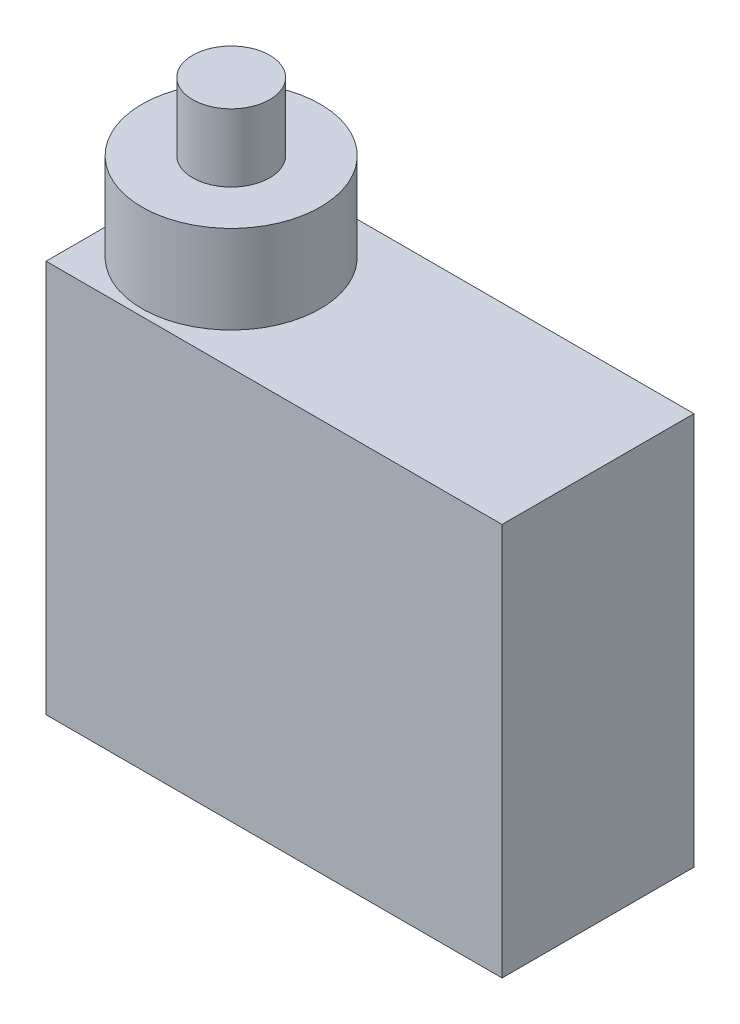
ISO-10303-21;
HEADER;
FILE_DESCRIPTION(('STEP AP214'),'2;1');
FILE_NAME('part.step','',(''),(''),'','','');
FILE_SCHEMA(('AUTOMOTIVE_DESIGN { 1 0 10303 214 1 1 1 1 }'));
ENDSEC;
DATA;
#1=APPLICATION_CONTEXT('core data for automotive mechanical design processes');
#2=APPLICATION_PROTOCOL_DEFINITION('international standard','automotive_design',2000,#1);
#3=PRODUCT_CONTEXT('',#1,'mechanical');
#4=PRODUCT('Part','Part','',(#3));
#5=PRODUCT_RELATED_PRODUCT_CATEGORY('part','',(#4));
#6=PRODUCT_DEFINITION_FORMATION('','',#4);
#7=PRODUCT_DEFINITION_CONTEXT('part definition',#1,'design');
#8=PRODUCT_DEFINITION('design','',#6,#7);
#9=PRODUCT_DEFINITION_SHAPE('','',#8);
#10=(LENGTH_UNIT() NAMED_UNIT(*) SI_UNIT(.MILLI.,.METRE.));
#11=(NAMED_UNIT(*) PLANE_ANGLE_UNIT() SI_UNIT($,.RADIAN.));
#12=(NAMED_UNIT(*) SI_UNIT($,.STERADIAN.) SOLID_ANGLE_UNIT());
#13=UNCERTAINTY_MEASURE_WITH_UNIT(LENGTH_MEASURE(1.E-05),#10,'distance_accuracy_value','');
#14=(GEOMETRIC_REPRESENTATION_CONTEXT(3) GLOBAL_UNCERTAINTY_ASSIGNED_CONTEXT((#13)) GLOBAL_UNIT_ASSIGNED_CONTEXT((#10,
#11,#12)) REPRESENTATION_CONTEXT('',''));
#15=CARTESIAN_POINT('',(0.,0.,0.));
#16=DIRECTION('',(0.,0.,1.));
#17=DIRECTION('',(1.,0.,0.));
#18=AXIS2_PLACEMENT_3D('',#15,#16,#17);
#19=CARTESIAN_POINT('',(-10.1,8.7,8.5));
#20=DIRECTION('',(1.,0.,0.));
#21=DIRECTION('',(0.,1.,0.));
#22=AXIS2_PLACEMENT_3D('',#19,#20,#21);
#23=PLANE('',#22);
#24=DIRECTION('',(0.,-1.,0.));
#25=VECTOR('',#24,1.);
#26=CARTESIAN_POINT('',(-10.1,8.7,0.));
#27=LINE('',#26,#25);
#28=CARTESIAN_POINT('',(-10.1,8.7,0.));
#29=VERTEX_POINT('',#28);
#30=CARTESIAN_POINT('',(-10.1,-8.7,0.));
#31=VERTEX_POINT('',#30);
#32=EDGE_CURVE('E109',#29,#31,#27,.T.);
#33=ORIENTED_EDGE('',*,*,#32,.T.);
#34=DIRECTION('',(0.,0.,-1.));
#35=VECTOR('',#34,1.);
#36=CARTESIAN_POINT('',(-10.1,-8.7,8.5));
#37=LINE('',#36,#35);
#38=CARTESIAN_POINT('',(-10.1,-8.7,8.5));
#39=VERTEX_POINT('',#38);
#40=EDGE_CURVE('E36',#39,#31,#37,.T.);
#41=ORIENTED_EDGE('',*,*,#40,.F.);
#42=DIRECTION('',(0.,-1.,0.));
#43=VECTOR('',#42,1.);
#44=CARTESIAN_POINT('',(-10.1,8.7,8.5));
#45=LINE('',#44,#43);
#46=CARTESIAN_POINT('',(-10.1,8.7,8.5));
#47=VERTEX_POINT('',#46);
#48=EDGE_CURVE('E89',#47,#39,#45,.T.);
#49=ORIENTED_EDGE('',*,*,#48,.F.);
#50=DIRECTION('',(0.,0.,-1.));
#51=VECTOR('',#50,1.);
#52=CARTESIAN_POINT('',(-10.1,8.7,8.5));
#53=LINE('',#52,#51);
#54=CARTESIAN_POINT('',(-10.1,8.7,4.25));
#55=VERTEX_POINT('',#54);
#56=EDGE_CURVE('E87',#47,#55,#53,.T.);
#57=ORIENTED_EDGE('',*,*,#56,.T.);
#58=EDGE_CURVE('E76',#55,#29,#53,.T.);
#59=ORIENTED_EDGE('',*,*,#58,.T.);
#60=EDGE_LOOP('',(#33,#41,#49,#57,#59));
#61=FACE_BOUND('',#60,.T.);
#62=ADVANCED_FACE('F33',(#61),#23,.F.);
#63=CARTESIAN_POINT('',(10.1,-8.7,8.5));
#64=DIRECTION('',(0.,1.,0.));
#65=DIRECTION('',(-1.,0.,0.));
#66=AXIS2_PLACEMENT_3D('',#63,#64,#65);
#67=PLANE('',#66);
#68=DIRECTION('',(1.,0.,0.));
#69=VECTOR('',#68,1.);
#70=CARTESIAN_POINT('',(10.1,-8.7,0.));
#71=LINE('',#70,#69);
#72=CARTESIAN_POINT('',(10.1,-8.7,0.));
#73=VERTEX_POINT('',#72);
#74=EDGE_CURVE('E108',#31,#73,#71,.T.);
#75=ORIENTED_EDGE('',*,*,#74,.T.);
#76=DIRECTION('',(0.,0.,-1.));
#77=VECTOR('',#76,1.);
#78=CARTESIAN_POINT('',(10.1,-8.7,8.5));
#79=LINE('',#78,#77);
#80=CARTESIAN_POINT('',(10.1,-8.7,8.5));
#81=VERTEX_POINT('',#80);
#82=EDGE_CURVE('E105',#81,#73,#79,.T.);
#83=ORIENTED_EDGE('',*,*,#82,.F.);
#84=DIRECTION('',(1.,0.,0.));
#85=VECTOR('',#84,1.);
#86=CARTESIAN_POINT('',(10.1,-8.7,8.5));
#87=LINE('',#86,#85);
#88=EDGE_CURVE('E84',#39,#81,#87,.T.);
#89=ORIENTED_EDGE('',*,*,#88,.F.);
#90=ORIENTED_EDGE('',*,*,#40,.T.);
#91=EDGE_LOOP('',(#75,#83,#89,#90));
#92=FACE_BOUND('',#91,.T.);
#93=ADVANCED_FACE('F107',(#92),#67,.F.);
#94=CARTESIAN_POINT('',(10.1,8.7,8.5));
#95=DIRECTION('',(-1.,0.,0.));
#96=DIRECTION('',(0.,-1.,0.));
#97=AXIS2_PLACEMENT_3D('',#94,#95,#96);
#98=PLANE('',#97);
#99=DIRECTION('',(0.,1.,0.));
#100=VECTOR('',#99,1.);
#101=CARTESIAN_POINT('',(10.1,8.7,0.));
#102=LINE('',#101,#100);
#103=CARTESIAN_POINT('',(10.1,8.7,0.));
#104=VERTEX_POINT('',#103);
#105=EDGE_CURVE('E68',#73,#104,#102,.T.);
#106=ORIENTED_EDGE('',*,*,#105,.T.);
#107=DIRECTION('',(0.,0.,-1.));
#108=VECTOR('',#107,1.);
#109=CARTESIAN_POINT('',(10.1,8.7,8.5));
#110=LINE('',#109,#108);
#111=CARTESIAN_POINT('',(10.1,8.7,8.5));
#112=VERTEX_POINT('',#111);
#113=EDGE_CURVE('E92',#112,#104,#110,.T.);
#114=ORIENTED_EDGE('',*,*,#113,.F.);
#115=DIRECTION('',(0.,1.,0.));
#116=VECTOR('',#115,1.);
#117=CARTESIAN_POINT('',(10.1,8.7,8.5));
#118=LINE('',#117,#116);
#119=EDGE_CURVE('E100',#81,#112,#118,.T.);
#120=ORIENTED_EDGE('',*,*,#119,.F.);
#121=ORIENTED_EDGE('',*,*,#82,.T.);
#122=EDGE_LOOP('',(#106,#114,#120,#121));
#123=FACE_BOUND('',#122,.T.);
#124=ADVANCED_FACE('F121',(#123),#98,.F.);
#125=CARTESIAN_POINT('',(10.1,8.7,8.5));
#126=DIRECTION('',(0.,-1.,0.));
#127=DIRECTION('',(1.,0.,0.));
#128=AXIS2_PLACEMENT_3D('',#125,#126,#127);
#129=PLANE('',#128);
#130=ORIENTED_EDGE('',*,*,#58,.F.);
#131=CARTESIAN_POINT('',(-6.15,8.7,4.25));
#132=DIRECTION('',(0.,1.,0.));
#133=DIRECTION('',(-1.,0.,0.));
#134=AXIS2_PLACEMENT_3D('',#131,#132,#133);
#135=CIRCLE('',#134,3.95);
#136=EDGE_CURVE('E96',#55,#55,#135,.T.);
#137=ORIENTED_EDGE('',*,*,#136,.F.);
#138=ORIENTED_EDGE('',*,*,#56,.F.);
#139=DIRECTION('',(-1.,0.,0.));
#140=VECTOR('',#139,1.);
#141=CARTESIAN_POINT('',(10.1,8.7,8.5));
#142=LINE('',#141,#140);
#143=EDGE_CURVE('E50',#112,#47,#142,.T.);
#144=ORIENTED_EDGE('',*,*,#143,.F.);
#145=ORIENTED_EDGE('',*,*,#113,.T.);
#146=DIRECTION('',(-1.,0.,0.));
#147=VECTOR('',#146,1.);
#148=CARTESIAN_POINT('',(10.1,8.7,0.));
#149=LINE('',#148,#147);
#150=EDGE_CURVE('E98',#104,#29,#149,.T.);
#151=ORIENTED_EDGE('',*,*,#150,.T.);
#152=EDGE_LOOP('',(#130,#137,#138,#144,#145,#151));
#153=FACE_BOUND('',#152,.T.);
#154=ADVANCED_FACE('F94',(#153),#129,.F.);
#155=CARTESIAN_POINT('',(0.,0.,8.5));
#156=DIRECTION('',(0.,0.,-1.));
#157=DIRECTION('',(-1.,0.,0.));
#158=AXIS2_PLACEMENT_3D('',#155,#156,#157);
#159=PLANE('',#158);
#160=ORIENTED_EDGE('',*,*,#48,.T.);
#161=ORIENTED_EDGE('',*,*,#88,.T.);
#162=ORIENTED_EDGE('',*,*,#119,.T.);
#163=ORIENTED_EDGE('',*,*,#143,.T.);
#164=EDGE_LOOP('',(#160,#161,#162,#163));
#165=FACE_BOUND('',#164,.T.);
#166=ADVANCED_FACE('F120',(#165),#159,.F.);
#167=CARTESIAN_POINT('',(0.,0.,0.));
#168=DIRECTION('',(0.,0.,-1.));
#169=DIRECTION('',(-1.,0.,0.));
#170=AXIS2_PLACEMENT_3D('',#167,#168,#169);
#171=PLANE('',#170);
#172=ORIENTED_EDGE('',*,*,#32,.F.);
#173=ORIENTED_EDGE('',*,*,#150,.F.);
#174=ORIENTED_EDGE('',*,*,#105,.F.);
#175=ORIENTED_EDGE('',*,*,#74,.F.);
#176=EDGE_LOOP('',(#172,#173,#174,#175));
#177=FACE_BOUND('',#176,.T.);
#178=ADVANCED_FACE('F122',(#177),#171,.T.);
#179=CARTESIAN_POINT('',(-6.15,12.6,4.25));
#180=DIRECTION('',(0.,-1.,0.));
#181=DIRECTION('',(1.,0.,0.));
#182=AXIS2_PLACEMENT_3D('',#179,#180,#181);
#183=CYLINDRICAL_SURFACE('',#182,3.95);
#184=CARTESIAN_POINT('',(-6.15,12.6,4.25));
#185=DIRECTION('',(0.,1.,0.));
#186=DIRECTION('',(-1.,0.,0.));
#187=AXIS2_PLACEMENT_3D('',#184,#185,#186);
#188=CIRCLE('',#187,3.95);
#189=CARTESIAN_POINT('',(-10.1,12.6,4.25));
#190=VERTEX_POINT('',#189);
#191=EDGE_CURVE('E111',#190,#190,#188,.T.);
#192=ORIENTED_EDGE('',*,*,#191,.F.);
#193=EDGE_LOOP('',(#192));
#194=FACE_BOUND('',#193,.T.);
#195=ORIENTED_EDGE('',*,*,#136,.T.);
#196=EDGE_LOOP('',(#195));
#197=FACE_BOUND('',#196,.T.);
#198=ADVANCED_FACE('F124',(#194,#197),#183,.T.);
#199=CARTESIAN_POINT('',(-6.15,12.6,4.25));
#200=DIRECTION('',(0.,1.,0.));
#201=DIRECTION('',(-1.,0.,0.));
#202=AXIS2_PLACEMENT_3D('',#199,#200,#201);
#203=PLANE('',#202);
#204=CARTESIAN_POINT('',(-6.14999999999999,12.6,4.25));
#205=DIRECTION('',(0.,1.,0.));
#206=DIRECTION('',(-1.,0.,0.));
#207=AXIS2_PLACEMENT_3D('',#204,#205,#206);
#208=CIRCLE('',#207,1.7065);
#209=CARTESIAN_POINT('',(-7.85649999999999,12.6,4.25));
#210=VERTEX_POINT('',#209);
#211=EDGE_CURVE('E11',#210,#210,#208,.T.);
#212=ORIENTED_EDGE('',*,*,#211,.F.);
#213=EDGE_LOOP('',(#212));
#214=FACE_BOUND('',#213,.T.);
#215=ORIENTED_EDGE('',*,*,#191,.T.);
#216=EDGE_LOOP('',(#215));
#217=FACE_BOUND('',#216,.T.);
#218=ADVANCED_FACE('F130',(#214,#217),#203,.T.);
#219=CARTESIAN_POINT('',(-6.14999999999999,15.6,4.25));
#220=DIRECTION('',(0.,-1.,0.));
#221=DIRECTION('',(1.,0.,0.));
#222=AXIS2_PLACEMENT_3D('',#219,#220,#221);
#223=CYLINDRICAL_SURFACE('',#222,1.7065);
#224=CARTESIAN_POINT('',(-6.14999999999999,15.6,4.25));
#225=DIRECTION('',(0.,1.,0.));
#226=DIRECTION('',(-1.,0.,0.));
#227=AXIS2_PLACEMENT_3D('',#224,#225,#226);
#228=CIRCLE('',#227,1.7065);
#229=CARTESIAN_POINT('',(-7.85649999999999,15.6,4.25));
#230=VERTEX_POINT('',#229);
#231=EDGE_CURVE('E211',#230,#230,#228,.T.);
#232=ORIENTED_EDGE('',*,*,#231,.F.);
#233=EDGE_LOOP('',(#232));
#234=FACE_BOUND('',#233,.T.);
#235=ORIENTED_EDGE('',*,*,#211,.T.);
#236=EDGE_LOOP('',(#235));
#237=FACE_BOUND('',#236,.T.);
#238=ADVANCED_FACE('F185',(#234,#237),#223,.T.);
#239=CARTESIAN_POINT('',(-6.14999999999999,15.6,4.25));
#240=DIRECTION('',(0.,1.,0.));
#241=DIRECTION('',(-1.,0.,0.));
#242=AXIS2_PLACEMENT_3D('',#239,#240,#241);
#243=PLANE('',#242);
#244=ORIENTED_EDGE('',*,*,#231,.T.);
#245=EDGE_LOOP('',(#244));
#246=FACE_BOUND('',#245,.T.);
#247=ADVANCED_FACE('F194',(#246),#243,.T.);
#248=CLOSED_SHELL('',(#62,#93,#124,#154,#166,#178,#198,#218,#238,#247));
#249=MANIFOLD_SOLID_BREP('B2',#248);
#250=ADVANCED_BREP_SHAPE_REPRESENTATION('',(#18,#249),#14);
#251=SHAPE_DEFINITION_REPRESENTATION(#9,#250);
ENDSEC;
END-ISO-10303-21;
